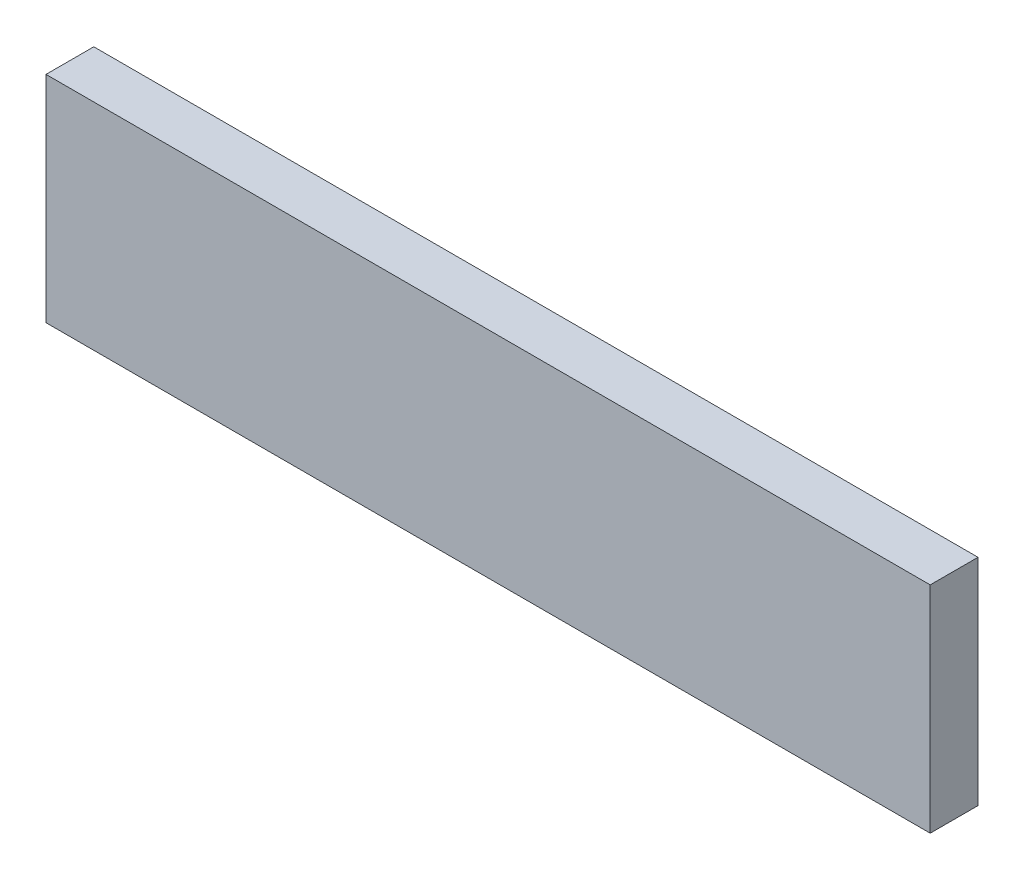
ISO-10303-21;
HEADER;
FILE_DESCRIPTION(('STEP AP214'),'2;1');
FILE_NAME('part.step','',(''),(''),'','','');
FILE_SCHEMA(('AUTOMOTIVE_DESIGN { 1 0 10303 214 1 1 1 1 }'));
ENDSEC;
DATA;
#1=APPLICATION_CONTEXT('core data for automotive mechanical design processes');
#2=APPLICATION_PROTOCOL_DEFINITION('international standard','automotive_design',2000,#1);
#3=PRODUCT_CONTEXT('',#1,'mechanical');
#4=PRODUCT('Part','Part','',(#3));
#5=PRODUCT_RELATED_PRODUCT_CATEGORY('part','',(#4));
#6=PRODUCT_DEFINITION_FORMATION('','',#4);
#7=PRODUCT_DEFINITION_CONTEXT('part definition',#1,'design');
#8=PRODUCT_DEFINITION('design','',#6,#7);
#9=PRODUCT_DEFINITION_SHAPE('','',#8);
#10=(LENGTH_UNIT() NAMED_UNIT(*) SI_UNIT(.MILLI.,.METRE.));
#11=(NAMED_UNIT(*) PLANE_ANGLE_UNIT() SI_UNIT($,.RADIAN.));
#12=(NAMED_UNIT(*) SI_UNIT($,.STERADIAN.) SOLID_ANGLE_UNIT());
#13=UNCERTAINTY_MEASURE_WITH_UNIT(LENGTH_MEASURE(1.E-05),#10,'distance_accuracy_value','');
#14=(GEOMETRIC_REPRESENTATION_CONTEXT(3) GLOBAL_UNCERTAINTY_ASSIGNED_CONTEXT((#13)) GLOBAL_UNIT_ASSIGNED_CONTEXT((#10,
#11,#12)) REPRESENTATION_CONTEXT('',''));
#15=CARTESIAN_POINT('',(0.,0.,0.));
#16=DIRECTION('',(0.,0.,1.));
#17=DIRECTION('',(1.,0.,0.));
#18=AXIS2_PLACEMENT_3D('',#15,#16,#17);
#19=CARTESIAN_POINT('',(-92.5,-22.5,10.));
#20=DIRECTION('',(1.,0.,0.));
#21=DIRECTION('',(0.,0.,-1.));
#22=AXIS2_PLACEMENT_3D('',#19,#20,#21);
#23=PLANE('',#22);
#24=DIRECTION('',(0.,-1.,0.));
#25=VECTOR('',#24,1.);
#26=CARTESIAN_POINT('',(-92.5,-22.5,0.));
#27=LINE('',#26,#25);
#28=CARTESIAN_POINT('',(-92.5,22.5,0.));
#29=VERTEX_POINT('',#28);
#30=CARTESIAN_POINT('',(-92.5,-22.5,0.));
#31=VERTEX_POINT('',#30);
#32=EDGE_CURVE('E99',#29,#31,#27,.T.);
#33=ORIENTED_EDGE('',*,*,#32,.T.);
#34=DIRECTION('',(0.,0.,-1.));
#35=VECTOR('',#34,1.);
#36=CARTESIAN_POINT('',(-92.5,-22.5,10.));
#37=LINE('',#36,#35);
#38=CARTESIAN_POINT('',(-92.5,-22.5,10.));
#39=VERTEX_POINT('',#38);
#40=EDGE_CURVE('E11',#39,#31,#37,.T.);
#41=ORIENTED_EDGE('',*,*,#40,.F.);
#42=DIRECTION('',(0.,-1.,0.));
#43=VECTOR('',#42,1.);
#44=CARTESIAN_POINT('',(-92.5,-22.5,10.));
#45=LINE('',#44,#43);
#46=CARTESIAN_POINT('',(-92.5,22.5,10.));
#47=VERTEX_POINT('',#46);
#48=EDGE_CURVE('E87',#47,#39,#45,.T.);
#49=ORIENTED_EDGE('',*,*,#48,.F.);
#50=DIRECTION('',(0.,0.,-1.));
#51=VECTOR('',#50,1.);
#52=CARTESIAN_POINT('',(-92.5,22.5,10.));
#53=LINE('',#52,#51);
#54=EDGE_CURVE('E95',#47,#29,#53,.T.);
#55=ORIENTED_EDGE('',*,*,#54,.T.);
#56=EDGE_LOOP('',(#33,#41,#49,#55));
#57=FACE_BOUND('',#56,.T.);
#58=ADVANCED_FACE('F36',(#57),#23,.F.);
#59=CARTESIAN_POINT('',(92.5,-22.5,10.));
#60=DIRECTION('',(0.,1.,0.));
#61=DIRECTION('',(-1.,0.,0.));
#62=AXIS2_PLACEMENT_3D('',#59,#60,#61);
#63=PLANE('',#62);
#64=DIRECTION('',(1.,0.,0.));
#65=VECTOR('',#64,1.);
#66=CARTESIAN_POINT('',(92.5,-22.5,0.));
#67=LINE('',#66,#65);
#68=CARTESIAN_POINT('',(92.5,-22.5,0.));
#69=VERTEX_POINT('',#68);
#70=EDGE_CURVE('E91',#31,#69,#67,.T.);
#71=ORIENTED_EDGE('',*,*,#70,.T.);
#72=DIRECTION('',(0.,0.,-1.));
#73=VECTOR('',#72,1.);
#74=CARTESIAN_POINT('',(92.5,-22.5,10.));
#75=LINE('',#74,#73);
#76=CARTESIAN_POINT('',(92.5,-22.5,10.));
#77=VERTEX_POINT('',#76);
#78=EDGE_CURVE('E44',#77,#69,#75,.T.);
#79=ORIENTED_EDGE('',*,*,#78,.F.);
#80=DIRECTION('',(1.,0.,0.));
#81=VECTOR('',#80,1.);
#82=CARTESIAN_POINT('',(92.5,-22.5,10.));
#83=LINE('',#82,#81);
#84=EDGE_CURVE('E82',#39,#77,#83,.T.);
#85=ORIENTED_EDGE('',*,*,#84,.F.);
#86=ORIENTED_EDGE('',*,*,#40,.T.);
#87=EDGE_LOOP('',(#71,#79,#85,#86));
#88=FACE_BOUND('',#87,.T.);
#89=ADVANCED_FACE('F90',(#88),#63,.F.);
#90=CARTESIAN_POINT('',(92.5,-22.5,10.));
#91=DIRECTION('',(-1.,0.,0.));
#92=DIRECTION('',(0.,0.,1.));
#93=AXIS2_PLACEMENT_3D('',#90,#91,#92);
#94=PLANE('',#93);
#95=DIRECTION('',(0.,1.,0.));
#96=VECTOR('',#95,1.);
#97=CARTESIAN_POINT('',(92.5,-22.5,0.));
#98=LINE('',#97,#96);
#99=CARTESIAN_POINT('',(92.5,22.5,0.));
#100=VERTEX_POINT('',#99);
#101=EDGE_CURVE('E69',#69,#100,#98,.T.);
#102=ORIENTED_EDGE('',*,*,#101,.T.);
#103=DIRECTION('',(0.,0.,-1.));
#104=VECTOR('',#103,1.);
#105=CARTESIAN_POINT('',(92.5,22.5,10.));
#106=LINE('',#105,#104);
#107=CARTESIAN_POINT('',(92.5,22.5,10.));
#108=VERTEX_POINT('',#107);
#109=EDGE_CURVE('E92',#108,#100,#106,.T.);
#110=ORIENTED_EDGE('',*,*,#109,.F.);
#111=DIRECTION('',(0.,1.,0.));
#112=VECTOR('',#111,1.);
#113=CARTESIAN_POINT('',(92.5,-22.5,10.));
#114=LINE('',#113,#112);
#115=EDGE_CURVE('E85',#77,#108,#114,.T.);
#116=ORIENTED_EDGE('',*,*,#115,.F.);
#117=ORIENTED_EDGE('',*,*,#78,.T.);
#118=EDGE_LOOP('',(#102,#110,#116,#117));
#119=FACE_BOUND('',#118,.T.);
#120=ADVANCED_FACE('F93',(#119),#94,.F.);
#121=CARTESIAN_POINT('',(92.5,22.5,10.));
#122=DIRECTION('',(0.,-1.,0.));
#123=DIRECTION('',(1.,0.,0.));
#124=AXIS2_PLACEMENT_3D('',#121,#122,#123);
#125=PLANE('',#124);
#126=DIRECTION('',(-1.,0.,0.));
#127=VECTOR('',#126,1.);
#128=CARTESIAN_POINT('',(92.5,22.5,0.));
#129=LINE('',#128,#127);
#130=EDGE_CURVE('E75',#100,#29,#129,.T.);
#131=ORIENTED_EDGE('',*,*,#130,.T.);
#132=ORIENTED_EDGE('',*,*,#54,.F.);
#133=DIRECTION('',(-1.,0.,0.));
#134=VECTOR('',#133,1.);
#135=CARTESIAN_POINT('',(92.5,22.5,10.));
#136=LINE('',#135,#134);
#137=EDGE_CURVE('E52',#108,#47,#136,.T.);
#138=ORIENTED_EDGE('',*,*,#137,.F.);
#139=ORIENTED_EDGE('',*,*,#109,.T.);
#140=EDGE_LOOP('',(#131,#132,#138,#139));
#141=FACE_BOUND('',#140,.T.);
#142=ADVANCED_FACE('F106',(#141),#125,.F.);
#143=CARTESIAN_POINT('',(0.,0.,10.));
#144=DIRECTION('',(0.,0.,1.));
#145=DIRECTION('',(1.,0.,0.));
#146=AXIS2_PLACEMENT_3D('',#143,#144,#145);
#147=PLANE('',#146);
#148=ORIENTED_EDGE('',*,*,#48,.T.);
#149=ORIENTED_EDGE('',*,*,#84,.T.);
#150=ORIENTED_EDGE('',*,*,#115,.T.);
#151=ORIENTED_EDGE('',*,*,#137,.T.);
#152=EDGE_LOOP('',(#148,#149,#150,#151));
#153=FACE_BOUND('',#152,.T.);
#154=ADVANCED_FACE('F83',(#153),#147,.T.);
#155=CARTESIAN_POINT('',(0.,0.,0.));
#156=DIRECTION('',(0.,0.,1.));
#157=DIRECTION('',(1.,0.,0.));
#158=AXIS2_PLACEMENT_3D('',#155,#156,#157);
#159=PLANE('',#158);
#160=ORIENTED_EDGE('',*,*,#32,.F.);
#161=ORIENTED_EDGE('',*,*,#130,.F.);
#162=ORIENTED_EDGE('',*,*,#101,.F.);
#163=ORIENTED_EDGE('',*,*,#70,.F.);
#164=EDGE_LOOP('',(#160,#161,#162,#163));
#165=FACE_BOUND('',#164,.T.);
#166=ADVANCED_FACE('F109',(#165),#159,.F.);
#167=CLOSED_SHELL('',(#58,#89,#120,#142,#154,#166));
#168=MANIFOLD_SOLID_BREP('B2',#167);
#169=ADVANCED_BREP_SHAPE_REPRESENTATION('',(#18,#168),#14);
#170=SHAPE_DEFINITION_REPRESENTATION(#9,#169);
ENDSEC;
END-ISO-10303-21;
